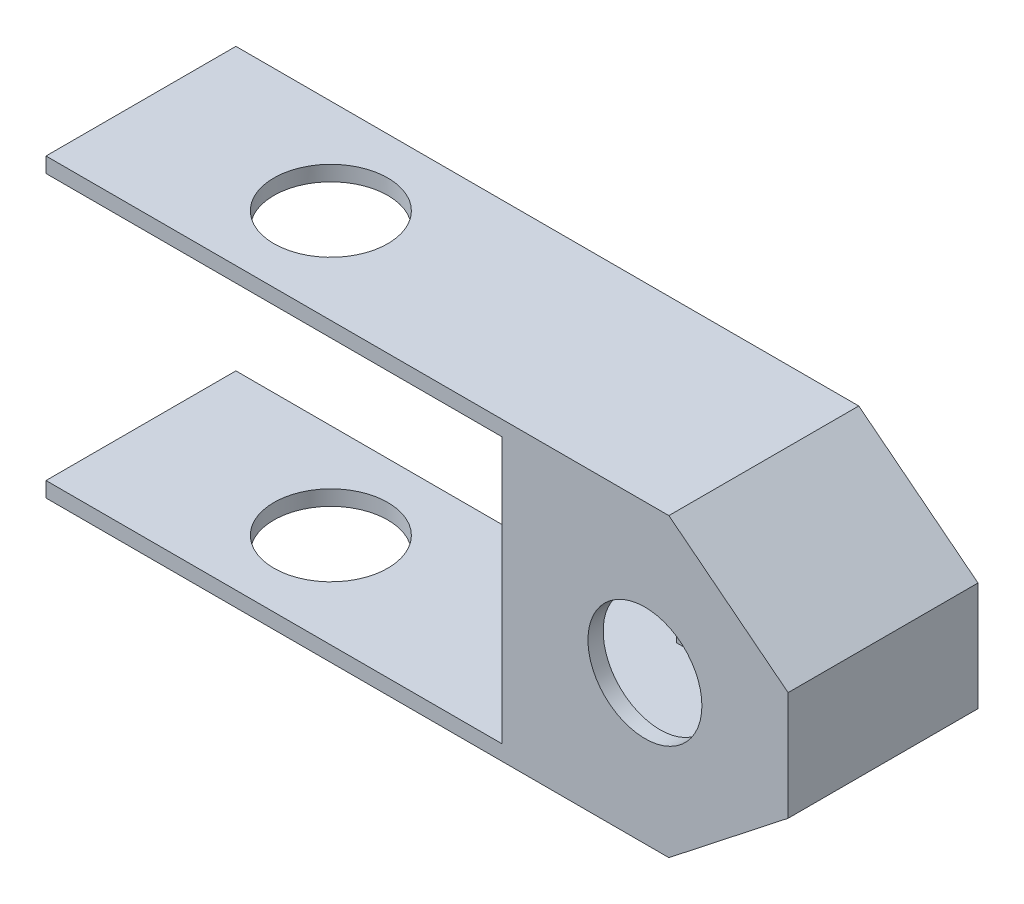
ISO-10303-21;
HEADER;
FILE_DESCRIPTION(('STEP AP214'),'2;1');
FILE_NAME('part.step','',(''),(''),'','','');
FILE_SCHEMA(('AUTOMOTIVE_DESIGN { 1 0 10303 214 1 1 1 1 }'));
ENDSEC;
DATA;
#1=APPLICATION_CONTEXT('core data for automotive mechanical design processes');
#2=APPLICATION_PROTOCOL_DEFINITION('international standard','automotive_design',2000,#1);
#3=PRODUCT_CONTEXT('',#1,'mechanical');
#4=PRODUCT('Part','Part','',(#3));
#5=PRODUCT_RELATED_PRODUCT_CATEGORY('part','',(#4));
#6=PRODUCT_DEFINITION_FORMATION('','',#4);
#7=PRODUCT_DEFINITION_CONTEXT('part definition',#1,'design');
#8=PRODUCT_DEFINITION('design','',#6,#7);
#9=PRODUCT_DEFINITION_SHAPE('','',#8);
#10=(LENGTH_UNIT() NAMED_UNIT(*) SI_UNIT(.MILLI.,.METRE.));
#11=(NAMED_UNIT(*) PLANE_ANGLE_UNIT() SI_UNIT($,.RADIAN.));
#12=(NAMED_UNIT(*) SI_UNIT($,.STERADIAN.) SOLID_ANGLE_UNIT());
#13=UNCERTAINTY_MEASURE_WITH_UNIT(LENGTH_MEASURE(1.E-05),#10,'distance_accuracy_value','');
#14=(GEOMETRIC_REPRESENTATION_CONTEXT(3) GLOBAL_UNCERTAINTY_ASSIGNED_CONTEXT((#13)) GLOBAL_UNIT_ASSIGNED_CONTEXT((#10,
#11,#12)) REPRESENTATION_CONTEXT('',''));
#15=CARTESIAN_POINT('',(0.,0.,0.));
#16=DIRECTION('',(0.,0.,1.));
#17=DIRECTION('',(1.,0.,0.));
#18=AXIS2_PLACEMENT_3D('',#15,#16,#17);
#19=CARTESIAN_POINT('',(0.,0.,0.));
#20=DIRECTION('',(-1.,0.,0.));
#21=DIRECTION('',(0.,0.,1.));
#22=AXIS2_PLACEMENT_3D('',#19,#20,#21);
#23=PLANE('',#22);
#24=DIRECTION('',(0.,0.,1.));
#25=VECTOR('',#24,1.);
#26=CARTESIAN_POINT('',(0.,0.,0.));
#27=LINE('',#26,#25);
#28=CARTESIAN_POINT('',(0.,0.,23.));
#29=VERTEX_POINT('',#28);
#30=CARTESIAN_POINT('',(0.,0.,25.));
#31=VERTEX_POINT('',#30);
#32=EDGE_CURVE('E269',#29,#31,#27,.T.);
#33=ORIENTED_EDGE('',*,*,#32,.F.);
#34=DIRECTION('',(0.,-1.,0.));
#35=VECTOR('',#34,1.);
#36=CARTESIAN_POINT('',(0.,0.,23.));
#37=LINE('',#36,#35);
#38=CARTESIAN_POINT('',(0.,-35.,23.));
#39=VERTEX_POINT('',#38);
#40=EDGE_CURVE('E218',#29,#39,#37,.T.);
#41=ORIENTED_EDGE('',*,*,#40,.T.);
#42=DIRECTION('',(0.,0.,1.));
#43=VECTOR('',#42,1.);
#44=CARTESIAN_POINT('',(0.,-35.,0.));
#45=LINE('',#44,#43);
#46=CARTESIAN_POINT('',(0.,-35.,25.));
#47=VERTEX_POINT('',#46);
#48=EDGE_CURVE('E248',#39,#47,#45,.T.);
#49=ORIENTED_EDGE('',*,*,#48,.T.);
#50=DIRECTION('',(0.,-1.,0.));
#51=VECTOR('',#50,1.);
#52=CARTESIAN_POINT('',(0.,0.,25.));
#53=LINE('',#52,#51);
#54=EDGE_CURVE('E252',#31,#47,#53,.T.);
#55=ORIENTED_EDGE('',*,*,#54,.F.);
#56=EDGE_LOOP('',(#33,#41,#49,#55));
#57=FACE_BOUND('',#56,.T.);
#58=ADVANCED_FACE('F41',(#57),#23,.T.);
#59=CARTESIAN_POINT('',(-60.,0.,25.));
#60=DIRECTION('',(1.,0.,0.));
#61=DIRECTION('',(0.,0.,-1.));
#62=AXIS2_PLACEMENT_3D('',#59,#60,#61);
#63=PLANE('',#62);
#64=DIRECTION('',(0.,0.,1.));
#65=VECTOR('',#64,1.);
#66=CARTESIAN_POINT('',(-60.,-35.,0.));
#67=LINE('',#66,#65);
#68=CARTESIAN_POINT('',(-60.,-35.,0.));
#69=VERTEX_POINT('',#68);
#70=CARTESIAN_POINT('',(-60.,-35.,25.));
#71=VERTEX_POINT('',#70);
#72=EDGE_CURVE('E259',#69,#71,#67,.T.);
#73=ORIENTED_EDGE('',*,*,#72,.F.);
#74=DIRECTION('',(0.,-1.,0.));
#75=VECTOR('',#74,1.);
#76=CARTESIAN_POINT('',(-60.,0.,0.));
#77=LINE('',#76,#75);
#78=CARTESIAN_POINT('',(-60.,-37.,0.));
#79=VERTEX_POINT('',#78);
#80=EDGE_CURVE('E262',#69,#79,#77,.T.);
#81=ORIENTED_EDGE('',*,*,#80,.T.);
#82=DIRECTION('',(0.,0.,-1.));
#83=VECTOR('',#82,1.);
#84=CARTESIAN_POINT('',(-60.,-37.,25.));
#85=LINE('',#84,#83);
#86=CARTESIAN_POINT('',(-60.,-37.,25.));
#87=VERTEX_POINT('',#86);
#88=EDGE_CURVE('E11',#87,#79,#85,.T.);
#89=ORIENTED_EDGE('',*,*,#88,.F.);
#90=DIRECTION('',(0.,-1.,0.));
#91=VECTOR('',#90,1.);
#92=CARTESIAN_POINT('',(-60.,0.,25.));
#93=LINE('',#92,#91);
#94=EDGE_CURVE('E279',#71,#87,#93,.T.);
#95=ORIENTED_EDGE('',*,*,#94,.F.);
#96=EDGE_LOOP('',(#73,#81,#89,#95));
#97=FACE_BOUND('',#96,.T.);
#98=ADVANCED_FACE('F43',(#97),#63,.F.);
#99=DIRECTION('',(0.,0.,1.));
#100=VECTOR('',#99,1.);
#101=CARTESIAN_POINT('',(-60.,0.,0.));
#102=LINE('',#101,#100);
#103=CARTESIAN_POINT('',(-60.,0.,0.));
#104=VERTEX_POINT('',#103);
#105=CARTESIAN_POINT('',(-60.,0.,25.));
#106=VERTEX_POINT('',#105);
#107=EDGE_CURVE('E263',#104,#106,#102,.T.);
#108=ORIENTED_EDGE('',*,*,#107,.T.);
#109=CARTESIAN_POINT('',(-60.,1.99999999999999,25.));
#110=VERTEX_POINT('',#109);
#111=EDGE_CURVE('E274',#110,#106,#93,.T.);
#112=ORIENTED_EDGE('',*,*,#111,.F.);
#113=DIRECTION('',(0.,0.,-1.));
#114=VECTOR('',#113,1.);
#115=CARTESIAN_POINT('',(-60.,1.99999999999999,25.));
#116=LINE('',#115,#114);
#117=CARTESIAN_POINT('',(-60.,1.99999999999999,0.));
#118=VERTEX_POINT('',#117);
#119=EDGE_CURVE('E297',#110,#118,#116,.T.);
#120=ORIENTED_EDGE('',*,*,#119,.T.);
#121=EDGE_CURVE('E298',#118,#104,#77,.T.);
#122=ORIENTED_EDGE('',*,*,#121,.T.);
#123=EDGE_LOOP('',(#108,#112,#120,#122));
#124=FACE_BOUND('',#123,.T.);
#125=ADVANCED_FACE('F352',(#124),#63,.F.);
#126=CARTESIAN_POINT('',(0.,0.,25.));
#127=DIRECTION('',(0.,0.,1.));
#128=DIRECTION('',(1.,0.,0.));
#129=AXIS2_PLACEMENT_3D('',#126,#127,#128);
#130=PLANE('',#129);
#131=CARTESIAN_POINT('',(18.8484526302729,-17.5,25.));
#132=DIRECTION('',(0.,0.,1.));
#133=DIRECTION('',(1.,0.,0.));
#134=AXIS2_PLACEMENT_3D('',#131,#132,#133);
#135=CIRCLE('',#134,7.5);
#136=CARTESIAN_POINT('',(26.3484526302729,-17.5,25.));
#137=VERTEX_POINT('',#136);
#138=EDGE_CURVE('E448',#137,#137,#135,.T.);
#139=ORIENTED_EDGE('',*,*,#138,.F.);
#140=EDGE_LOOP('',(#139));
#141=FACE_BOUND('',#140,.T.);
#142=ORIENTED_EDGE('',*,*,#54,.T.);
#143=DIRECTION('',(-1.,0.,0.));
#144=VECTOR('',#143,1.);
#145=CARTESIAN_POINT('',(0.,-35.,25.));
#146=LINE('',#145,#144);
#147=EDGE_CURVE('E237',#47,#71,#146,.T.);
#148=ORIENTED_EDGE('',*,*,#147,.T.);
#149=ORIENTED_EDGE('',*,*,#94,.T.);
#150=DIRECTION('',(-1.,0.,0.));
#151=VECTOR('',#150,1.);
#152=CARTESIAN_POINT('',(0.,-37.,25.));
#153=LINE('',#152,#151);
#154=CARTESIAN_POINT('',(22.,-37.,25.));
#155=VERTEX_POINT('',#154);
#156=EDGE_CURVE('E278',#155,#87,#153,.T.);
#157=ORIENTED_EDGE('',*,*,#156,.F.);
#158=DIRECTION('',(0.78628435317527,0.617864803943182,0.));
#159=VECTOR('',#158,1.);
#160=CARTESIAN_POINT('',(26.3738969765129,-33.5629775195864,25.));
#161=LINE('',#160,#159);
#162=CARTESIAN_POINT('',(37.6969052605458,-24.6653207555818,25.));
#163=VERTEX_POINT('',#162);
#164=EDGE_CURVE('E283',#155,#163,#161,.T.);
#165=ORIENTED_EDGE('',*,*,#164,.T.);
#166=DIRECTION('',(0.,1.,0.));
#167=VECTOR('',#166,1.);
#168=CARTESIAN_POINT('',(37.6969052605458,0.,25.));
#169=LINE('',#168,#167);
#170=CARTESIAN_POINT('',(37.6969052605458,-10.3346792444182,25.));
#171=VERTEX_POINT('',#170);
#172=EDGE_CURVE('E286',#163,#171,#169,.T.);
#173=ORIENTED_EDGE('',*,*,#172,.T.);
#174=DIRECTION('',(0.78628435317527,-0.617864803943182,0.));
#175=VECTOR('',#174,1.);
#176=CARTESIAN_POINT('',(9.37028700637488,11.9244695778976,25.));
#177=LINE('',#176,#175);
#178=CARTESIAN_POINT('',(22.,2.,25.));
#179=VERTEX_POINT('',#178);
#180=EDGE_CURVE('E289',#179,#171,#177,.T.);
#181=ORIENTED_EDGE('',*,*,#180,.F.);
#182=DIRECTION('',(1.,0.,0.));
#183=VECTOR('',#182,1.);
#184=CARTESIAN_POINT('',(0.,2.,25.));
#185=LINE('',#184,#183);
#186=EDGE_CURVE('E293',#110,#179,#185,.T.);
#187=ORIENTED_EDGE('',*,*,#186,.F.);
#188=ORIENTED_EDGE('',*,*,#111,.T.);
#189=DIRECTION('',(1.,0.,0.));
#190=VECTOR('',#189,1.);
#191=CARTESIAN_POINT('',(0.,0.,25.));
#192=LINE('',#191,#190);
#193=EDGE_CURVE('E242',#106,#31,#192,.T.);
#194=ORIENTED_EDGE('',*,*,#193,.T.);
#195=EDGE_LOOP('',(#142,#148,#149,#157,#165,#173,#181,#187,#188,#194));
#196=FACE_BOUND('',#195,.T.);
#197=ADVANCED_FACE('F355',(#141,#196),#130,.T.);
#198=CARTESIAN_POINT('',(0.,0.,0.));
#199=DIRECTION('',(0.,0.,1.));
#200=DIRECTION('',(1.,0.,0.));
#201=AXIS2_PLACEMENT_3D('',#198,#199,#200);
#202=PLANE('',#201);
#203=CARTESIAN_POINT('',(18.8484526302729,-17.5,0.));
#204=DIRECTION('',(0.,0.,1.));
#205=DIRECTION('',(1.,0.,0.));
#206=AXIS2_PLACEMENT_3D('',#203,#204,#205);
#207=CIRCLE('',#206,7.5);
#208=CARTESIAN_POINT('',(26.3484526302729,-17.5,0.));
#209=VERTEX_POINT('',#208);
#210=EDGE_CURVE('E222',#209,#209,#207,.T.);
#211=ORIENTED_EDGE('',*,*,#210,.T.);
#212=EDGE_LOOP('',(#211));
#213=FACE_BOUND('',#212,.T.);
#214=DIRECTION('',(-1.,0.,0.));
#215=VECTOR('',#214,1.);
#216=CARTESIAN_POINT('',(0.,-35.,0.));
#217=LINE('',#216,#215);
#218=CARTESIAN_POINT('',(0.,-35.,0.));
#219=VERTEX_POINT('',#218);
#220=EDGE_CURVE('E238',#219,#69,#217,.T.);
#221=ORIENTED_EDGE('',*,*,#220,.F.);
#222=DIRECTION('',(0.,-1.,0.));
#223=VECTOR('',#222,1.);
#224=CARTESIAN_POINT('',(0.,0.,0.));
#225=LINE('',#224,#223);
#226=CARTESIAN_POINT('',(0.,0.,0.));
#227=VERTEX_POINT('',#226);
#228=EDGE_CURVE('E241',#227,#219,#225,.T.);
#229=ORIENTED_EDGE('',*,*,#228,.F.);
#230=DIRECTION('',(1.,0.,0.));
#231=VECTOR('',#230,1.);
#232=CARTESIAN_POINT('',(0.,0.,0.));
#233=LINE('',#232,#231);
#234=EDGE_CURVE('E245',#104,#227,#233,.T.);
#235=ORIENTED_EDGE('',*,*,#234,.F.);
#236=ORIENTED_EDGE('',*,*,#121,.F.);
#237=DIRECTION('',(1.,0.,0.));
#238=VECTOR('',#237,1.);
#239=CARTESIAN_POINT('',(0.,2.,0.));
#240=LINE('',#239,#238);
#241=CARTESIAN_POINT('',(22.,2.,0.));
#242=VERTEX_POINT('',#241);
#243=EDGE_CURVE('E317',#118,#242,#240,.T.);
#244=ORIENTED_EDGE('',*,*,#243,.T.);
#245=DIRECTION('',(0.78628435317527,-0.617864803943182,0.));
#246=VECTOR('',#245,1.);
#247=CARTESIAN_POINT('',(9.37028700637488,11.9244695778976,0.));
#248=LINE('',#247,#246);
#249=CARTESIAN_POINT('',(37.6969052605458,-10.3346792444182,0.));
#250=VERTEX_POINT('',#249);
#251=EDGE_CURVE('E313',#242,#250,#248,.T.);
#252=ORIENTED_EDGE('',*,*,#251,.T.);
#253=DIRECTION('',(0.,1.,0.));
#254=VECTOR('',#253,1.);
#255=CARTESIAN_POINT('',(37.6969052605458,0.,0.));
#256=LINE('',#255,#254);
#257=CARTESIAN_POINT('',(37.6969052605458,-24.6653207555818,0.));
#258=VERTEX_POINT('',#257);
#259=EDGE_CURVE('E309',#258,#250,#256,.T.);
#260=ORIENTED_EDGE('',*,*,#259,.F.);
#261=DIRECTION('',(0.78628435317527,0.617864803943182,0.));
#262=VECTOR('',#261,1.);
#263=CARTESIAN_POINT('',(26.3738969765129,-33.5629775195864,0.));
#264=LINE('',#263,#262);
#265=CARTESIAN_POINT('',(22.,-37.,0.));
#266=VERTEX_POINT('',#265);
#267=EDGE_CURVE('E306',#266,#258,#264,.T.);
#268=ORIENTED_EDGE('',*,*,#267,.F.);
#269=DIRECTION('',(-1.,0.,0.));
#270=VECTOR('',#269,1.);
#271=CARTESIAN_POINT('',(0.,-37.,0.));
#272=LINE('',#271,#270);
#273=EDGE_CURVE('E302',#266,#79,#272,.T.);
#274=ORIENTED_EDGE('',*,*,#273,.T.);
#275=ORIENTED_EDGE('',*,*,#80,.F.);
#276=EDGE_LOOP('',(#221,#229,#235,#236,#244,#252,#260,#268,#274,#275));
#277=FACE_BOUND('',#276,.T.);
#278=ADVANCED_FACE('F363',(#213,#277),#202,.F.);
#279=CARTESIAN_POINT('',(0.,-37.,25.));
#280=DIRECTION('',(0.,-1.,0.));
#281=DIRECTION('',(1.,0.,0.));
#282=AXIS2_PLACEMENT_3D('',#279,#280,#281);
#283=PLANE('',#282);
#284=CARTESIAN_POINT('',(-35.,-37.,12.5));
#285=DIRECTION('',(0.,-1.,0.));
#286=DIRECTION('',(1.,0.,0.));
#287=AXIS2_PLACEMENT_3D('',#284,#285,#286);
#288=CIRCLE('',#287,7.5);
#289=CARTESIAN_POINT('',(-27.5,-37.,12.5));
#290=VERTEX_POINT('',#289);
#291=EDGE_CURVE('E233',#290,#290,#288,.T.);
#292=ORIENTED_EDGE('',*,*,#291,.F.);
#293=EDGE_LOOP('',(#292));
#294=FACE_BOUND('',#293,.T.);
#295=ORIENTED_EDGE('',*,*,#273,.F.);
#296=DIRECTION('',(0.,0.,-1.));
#297=VECTOR('',#296,1.);
#298=CARTESIAN_POINT('',(22.,-37.,25.));
#299=LINE('',#298,#297);
#300=EDGE_CURVE('E51',#155,#266,#299,.T.);
#301=ORIENTED_EDGE('',*,*,#300,.F.);
#302=ORIENTED_EDGE('',*,*,#156,.T.);
#303=ORIENTED_EDGE('',*,*,#88,.T.);
#304=EDGE_LOOP('',(#295,#301,#302,#303));
#305=FACE_BOUND('',#304,.T.);
#306=ADVANCED_FACE('F400',(#294,#305),#283,.T.);
#307=CARTESIAN_POINT('',(26.3738969765129,-33.5629775195864,25.));
#308=DIRECTION('',(-0.617864803943182,0.78628435317527,0.));
#309=DIRECTION('',(-0.78628435317527,-0.617864803943182,0.));
#310=AXIS2_PLACEMENT_3D('',#307,#308,#309);
#311=PLANE('',#310);
#312=ORIENTED_EDGE('',*,*,#267,.T.);
#313=DIRECTION('',(0.,0.,-1.));
#314=VECTOR('',#313,1.);
#315=CARTESIAN_POINT('',(37.6969052605458,-24.6653207555818,25.));
#316=LINE('',#315,#314);
#317=EDGE_CURVE('E329',#163,#258,#316,.T.);
#318=ORIENTED_EDGE('',*,*,#317,.F.);
#319=ORIENTED_EDGE('',*,*,#164,.F.);
#320=ORIENTED_EDGE('',*,*,#300,.T.);
#321=EDGE_LOOP('',(#312,#318,#319,#320));
#322=FACE_BOUND('',#321,.T.);
#323=ADVANCED_FACE('F405',(#322),#311,.F.);
#324=CARTESIAN_POINT('',(37.6969052605458,0.,25.));
#325=DIRECTION('',(-1.,0.,0.));
#326=DIRECTION('',(0.,0.,1.));
#327=AXIS2_PLACEMENT_3D('',#324,#325,#326);
#328=PLANE('',#327);
#329=ORIENTED_EDGE('',*,*,#259,.T.);
#330=DIRECTION('',(0.,0.,-1.));
#331=VECTOR('',#330,1.);
#332=CARTESIAN_POINT('',(37.6969052605458,-10.3346792444182,25.));
#333=LINE('',#332,#331);
#334=EDGE_CURVE('E326',#171,#250,#333,.T.);
#335=ORIENTED_EDGE('',*,*,#334,.F.);
#336=ORIENTED_EDGE('',*,*,#172,.F.);
#337=ORIENTED_EDGE('',*,*,#317,.T.);
#338=EDGE_LOOP('',(#329,#335,#336,#337));
#339=FACE_BOUND('',#338,.T.);
#340=ADVANCED_FACE('F409',(#339),#328,.F.);
#341=CARTESIAN_POINT('',(9.37028700637488,11.9244695778976,25.));
#342=DIRECTION('',(0.617864803943182,0.78628435317527,0.));
#343=DIRECTION('',(-0.78628435317527,0.617864803943182,0.));
#344=AXIS2_PLACEMENT_3D('',#341,#342,#343);
#345=PLANE('',#344);
#346=ORIENTED_EDGE('',*,*,#251,.F.);
#347=DIRECTION('',(0.,0.,-1.));
#348=VECTOR('',#347,1.);
#349=CARTESIAN_POINT('',(22.,2.,25.));
#350=LINE('',#349,#348);
#351=EDGE_CURVE('E323',#179,#242,#350,.T.);
#352=ORIENTED_EDGE('',*,*,#351,.F.);
#353=ORIENTED_EDGE('',*,*,#180,.T.);
#354=ORIENTED_EDGE('',*,*,#334,.T.);
#355=EDGE_LOOP('',(#346,#352,#353,#354));
#356=FACE_BOUND('',#355,.T.);
#357=ADVANCED_FACE('F412',(#356),#345,.T.);
#358=CARTESIAN_POINT('',(0.,2.,25.));
#359=DIRECTION('',(0.,1.,0.));
#360=DIRECTION('',(0.,0.,1.));
#361=AXIS2_PLACEMENT_3D('',#358,#359,#360);
#362=PLANE('',#361);
#363=CARTESIAN_POINT('',(-35.,2.,12.5));
#364=DIRECTION('',(0.,1.,0.));
#365=DIRECTION('',(0.,0.,1.));
#366=AXIS2_PLACEMENT_3D('',#363,#364,#365);
#367=CIRCLE('',#366,7.5);
#368=CARTESIAN_POINT('',(-35.,2.,20.));
#369=VERTEX_POINT('',#368);
#370=EDGE_CURVE('E211',#369,#369,#367,.T.);
#371=ORIENTED_EDGE('',*,*,#370,.F.);
#372=EDGE_LOOP('',(#371));
#373=FACE_BOUND('',#372,.T.);
#374=ORIENTED_EDGE('',*,*,#243,.F.);
#375=ORIENTED_EDGE('',*,*,#119,.F.);
#376=ORIENTED_EDGE('',*,*,#186,.T.);
#377=ORIENTED_EDGE('',*,*,#351,.T.);
#378=EDGE_LOOP('',(#374,#375,#376,#377));
#379=FACE_BOUND('',#378,.T.);
#380=ADVANCED_FACE('F359',(#373,#379),#362,.T.);
#381=CARTESIAN_POINT('',(0.,-35.,0.));
#382=DIRECTION('',(0.,1.,0.));
#383=DIRECTION('',(0.,0.,1.));
#384=AXIS2_PLACEMENT_3D('',#381,#382,#383);
#385=PLANE('',#384);
#386=CARTESIAN_POINT('',(-35.,-35.,12.5));
#387=DIRECTION('',(0.,1.,0.));
#388=DIRECTION('',(0.,0.,1.));
#389=AXIS2_PLACEMENT_3D('',#386,#387,#388);
#390=CIRCLE('',#389,7.5);
#391=CARTESIAN_POINT('',(-35.,-35.,20.));
#392=VERTEX_POINT('',#391);
#393=EDGE_CURVE('E229',#392,#392,#390,.T.);
#394=ORIENTED_EDGE('',*,*,#393,.F.);
#395=EDGE_LOOP('',(#394));
#396=FACE_BOUND('',#395,.T.);
#397=ORIENTED_EDGE('',*,*,#147,.F.);
#398=ORIENTED_EDGE('',*,*,#48,.F.);
#399=DIRECTION('',(-1.,0.,0.));
#400=VECTOR('',#399,1.);
#401=CARTESIAN_POINT('',(0.,-35.,23.));
#402=LINE('',#401,#400);
#403=CARTESIAN_POINT('',(21.3082122643633,-35.,23.));
#404=VERTEX_POINT('',#403);
#405=EDGE_CURVE('E170',#404,#39,#402,.T.);
#406=ORIENTED_EDGE('',*,*,#405,.F.);
#407=DIRECTION('',(0.,0.,-1.));
#408=VECTOR('',#407,1.);
#409=CARTESIAN_POINT('',(21.3082122643633,-35.,25.));
#410=LINE('',#409,#408);
#411=CARTESIAN_POINT('',(21.3082122643633,-35.,2.));
#412=VERTEX_POINT('',#411);
#413=EDGE_CURVE('E165',#404,#412,#410,.T.);
#414=ORIENTED_EDGE('',*,*,#413,.T.);
#415=DIRECTION('',(-1.,0.,0.));
#416=VECTOR('',#415,1.);
#417=CARTESIAN_POINT('',(0.,-35.,2.));
#418=LINE('',#417,#416);
#419=CARTESIAN_POINT('',(0.,-35.,2.));
#420=VERTEX_POINT('',#419);
#421=EDGE_CURVE('E205',#412,#420,#418,.T.);
#422=ORIENTED_EDGE('',*,*,#421,.T.);
#423=EDGE_CURVE('E270',#219,#420,#45,.T.);
#424=ORIENTED_EDGE('',*,*,#423,.F.);
#425=ORIENTED_EDGE('',*,*,#220,.T.);
#426=ORIENTED_EDGE('',*,*,#72,.T.);
#427=EDGE_LOOP('',(#397,#398,#406,#414,#422,#424,#425,#426));
#428=FACE_BOUND('',#427,.T.);
#429=ADVANCED_FACE('F344',(#396,#428),#385,.T.);
#430=CARTESIAN_POINT('',(0.,0.,0.));
#431=DIRECTION('',(0.,-1.,0.));
#432=DIRECTION('',(0.,0.,-1.));
#433=AXIS2_PLACEMENT_3D('',#430,#431,#432);
#434=PLANE('',#433);
#435=CARTESIAN_POINT('',(-35.,0.,12.5));
#436=DIRECTION('',(0.,-1.,0.));
#437=DIRECTION('',(0.,0.,-1.));
#438=AXIS2_PLACEMENT_3D('',#435,#436,#437);
#439=CIRCLE('',#438,7.5);
#440=CARTESIAN_POINT('',(-35.,0.,5.));
#441=VERTEX_POINT('',#440);
#442=EDGE_CURVE('E228',#441,#441,#439,.T.);
#443=ORIENTED_EDGE('',*,*,#442,.F.);
#444=EDGE_LOOP('',(#443));
#445=FACE_BOUND('',#444,.T.);
#446=ORIENTED_EDGE('',*,*,#193,.F.);
#447=ORIENTED_EDGE('',*,*,#107,.F.);
#448=ORIENTED_EDGE('',*,*,#234,.T.);
#449=CARTESIAN_POINT('',(0.,0.,2.));
#450=VERTEX_POINT('',#449);
#451=EDGE_CURVE('E67',#227,#450,#27,.T.);
#452=ORIENTED_EDGE('',*,*,#451,.T.);
#453=DIRECTION('',(1.,0.,0.));
#454=VECTOR('',#453,1.);
#455=CARTESIAN_POINT('',(0.,0.,2.));
#456=LINE('',#455,#454);
#457=CARTESIAN_POINT('',(21.3082122643633,0.,2.));
#458=VERTEX_POINT('',#457);
#459=EDGE_CURVE('E193',#450,#458,#456,.T.);
#460=ORIENTED_EDGE('',*,*,#459,.T.);
#461=DIRECTION('',(0.,0.,-1.));
#462=VECTOR('',#461,1.);
#463=CARTESIAN_POINT('',(21.3082122643633,0.,25.));
#464=LINE('',#463,#462);
#465=CARTESIAN_POINT('',(21.3082122643633,0.,23.));
#466=VERTEX_POINT('',#465);
#467=EDGE_CURVE('E192',#466,#458,#464,.T.);
#468=ORIENTED_EDGE('',*,*,#467,.F.);
#469=DIRECTION('',(1.,0.,0.));
#470=VECTOR('',#469,1.);
#471=CARTESIAN_POINT('',(0.,0.,23.));
#472=LINE('',#471,#470);
#473=EDGE_CURVE('E59',#29,#466,#472,.T.);
#474=ORIENTED_EDGE('',*,*,#473,.F.);
#475=ORIENTED_EDGE('',*,*,#32,.T.);
#476=EDGE_LOOP('',(#446,#447,#448,#452,#460,#468,#474,#475));
#477=FACE_BOUND('',#476,.T.);
#478=ADVANCED_FACE('F341',(#445,#477),#434,.T.);
#479=DIRECTION('',(0.,-1.,0.));
#480=VECTOR('',#479,1.);
#481=CARTESIAN_POINT('',(0.,0.,2.));
#482=LINE('',#481,#480);
#483=EDGE_CURVE('E209',#450,#420,#482,.T.);
#484=ORIENTED_EDGE('',*,*,#483,.F.);
#485=ORIENTED_EDGE('',*,*,#451,.F.);
#486=ORIENTED_EDGE('',*,*,#228,.T.);
#487=ORIENTED_EDGE('',*,*,#423,.T.);
#488=EDGE_LOOP('',(#484,#485,#486,#487));
#489=FACE_BOUND('',#488,.T.);
#490=ADVANCED_FACE('F343',(#489),#23,.T.);
#491=CARTESIAN_POINT('',(-35.,-65.,12.5));
#492=DIRECTION('',(0.,1.,0.));
#493=DIRECTION('',(0.,0.,1.));
#494=AXIS2_PLACEMENT_3D('',#491,#492,#493);
#495=CYLINDRICAL_SURFACE('',#494,7.5);
#496=ORIENTED_EDGE('',*,*,#442,.T.);
#497=EDGE_LOOP('',(#496));
#498=FACE_BOUND('',#497,.T.);
#499=ORIENTED_EDGE('',*,*,#370,.T.);
#500=EDGE_LOOP('',(#499));
#501=FACE_BOUND('',#500,.T.);
#502=ADVANCED_FACE('F338',(#498,#501),#495,.F.);
#503=ORIENTED_EDGE('',*,*,#291,.T.);
#504=EDGE_LOOP('',(#503));
#505=FACE_BOUND('',#504,.T.);
#506=ORIENTED_EDGE('',*,*,#393,.T.);
#507=EDGE_LOOP('',(#506));
#508=FACE_BOUND('',#507,.T.);
#509=ADVANCED_FACE('F379',(#505,#508),#495,.F.);
#510=CARTESIAN_POINT('',(0.,0.,23.));
#511=DIRECTION('',(0.,0.,1.));
#512=DIRECTION('',(1.,0.,0.));
#513=AXIS2_PLACEMENT_3D('',#510,#511,#512);
#514=PLANE('',#513);
#515=CARTESIAN_POINT('',(18.8484526302729,-17.5,23.));
#516=DIRECTION('',(0.,0.,1.));
#517=DIRECTION('',(1.,0.,0.));
#518=AXIS2_PLACEMENT_3D('',#515,#516,#517);
#519=CIRCLE('',#518,7.5);
#520=CARTESIAN_POINT('',(26.3484526302729,-17.5,23.));
#521=VERTEX_POINT('',#520);
#522=EDGE_CURVE('E454',#521,#521,#519,.T.);
#523=ORIENTED_EDGE('',*,*,#522,.T.);
#524=EDGE_LOOP('',(#523));
#525=FACE_BOUND('',#524,.T.);
#526=ORIENTED_EDGE('',*,*,#473,.T.);
#527=DIRECTION('',(0.78628435317527,-0.617864803943182,0.));
#528=VECTOR('',#527,1.);
#529=CARTESIAN_POINT('',(8.13455739848852,10.351900871547,23.));
#530=LINE('',#529,#528);
#531=CARTESIAN_POINT('',(35.6969052605458,-11.3066817890794,23.));
#532=VERTEX_POINT('',#531);
#533=EDGE_CURVE('E183',#466,#532,#530,.T.);
#534=ORIENTED_EDGE('',*,*,#533,.T.);
#535=DIRECTION('',(0.,1.,0.));
#536=VECTOR('',#535,1.);
#537=CARTESIAN_POINT('',(35.6969052605458,0.,23.));
#538=LINE('',#537,#536);
#539=CARTESIAN_POINT('',(35.6969052605458,-23.6933182109206,23.));
#540=VERTEX_POINT('',#539);
#541=EDGE_CURVE('E169',#540,#532,#538,.T.);
#542=ORIENTED_EDGE('',*,*,#541,.F.);
#543=DIRECTION('',(0.78628435317527,0.617864803943182,0.));
#544=VECTOR('',#543,1.);
#545=CARTESIAN_POINT('',(25.1381673686266,-31.9904088132359,23.));
#546=LINE('',#545,#544);
#547=EDGE_CURVE('E159',#404,#540,#546,.T.);
#548=ORIENTED_EDGE('',*,*,#547,.F.);
#549=ORIENTED_EDGE('',*,*,#405,.T.);
#550=ORIENTED_EDGE('',*,*,#40,.F.);
#551=EDGE_LOOP('',(#526,#534,#542,#548,#549,#550));
#552=FACE_BOUND('',#551,.T.);
#553=ADVANCED_FACE('F181',(#525,#552),#514,.F.);
#554=CARTESIAN_POINT('',(0.,0.,2.));
#555=DIRECTION('',(0.,0.,1.));
#556=DIRECTION('',(1.,0.,0.));
#557=AXIS2_PLACEMENT_3D('',#554,#555,#556);
#558=PLANE('',#557);
#559=CARTESIAN_POINT('',(18.8484526302729,-17.5,2.));
#560=DIRECTION('',(0.,0.,1.));
#561=DIRECTION('',(1.,0.,0.));
#562=AXIS2_PLACEMENT_3D('',#559,#560,#561);
#563=CIRCLE('',#562,7.5);
#564=CARTESIAN_POINT('',(26.3484526302729,-17.5,2.));
#565=VERTEX_POINT('',#564);
#566=EDGE_CURVE('E45',#565,#565,#563,.T.);
#567=ORIENTED_EDGE('',*,*,#566,.F.);
#568=EDGE_LOOP('',(#567));
#569=FACE_BOUND('',#568,.T.);
#570=ORIENTED_EDGE('',*,*,#421,.F.);
#571=DIRECTION('',(0.78628435317527,0.617864803943182,0.));
#572=VECTOR('',#571,1.);
#573=CARTESIAN_POINT('',(25.1381673686266,-31.9904088132359,2.));
#574=LINE('',#573,#572);
#575=CARTESIAN_POINT('',(35.6969052605458,-23.6933182109206,2.));
#576=VERTEX_POINT('',#575);
#577=EDGE_CURVE('E202',#412,#576,#574,.T.);
#578=ORIENTED_EDGE('',*,*,#577,.T.);
#579=DIRECTION('',(0.,1.,0.));
#580=VECTOR('',#579,1.);
#581=CARTESIAN_POINT('',(35.6969052605458,0.,2.));
#582=LINE('',#581,#580);
#583=CARTESIAN_POINT('',(35.6969052605458,-11.3066817890794,2.));
#584=VERTEX_POINT('',#583);
#585=EDGE_CURVE('E176',#576,#584,#582,.T.);
#586=ORIENTED_EDGE('',*,*,#585,.T.);
#587=DIRECTION('',(0.78628435317527,-0.617864803943182,0.));
#588=VECTOR('',#587,1.);
#589=CARTESIAN_POINT('',(8.13455739848852,10.351900871547,2.));
#590=LINE('',#589,#588);
#591=EDGE_CURVE('E196',#458,#584,#590,.T.);
#592=ORIENTED_EDGE('',*,*,#591,.F.);
#593=ORIENTED_EDGE('',*,*,#459,.F.);
#594=ORIENTED_EDGE('',*,*,#483,.T.);
#595=EDGE_LOOP('',(#570,#578,#586,#592,#593,#594));
#596=FACE_BOUND('',#595,.T.);
#597=ADVANCED_FACE('F370',(#569,#596),#558,.T.);
#598=CARTESIAN_POINT('',(25.1381673686266,-31.9904088132359,25.));
#599=DIRECTION('',(-0.617864803943182,0.78628435317527,0.));
#600=DIRECTION('',(-0.78628435317527,-0.617864803943182,0.));
#601=AXIS2_PLACEMENT_3D('',#598,#599,#600);
#602=PLANE('',#601);
#603=ORIENTED_EDGE('',*,*,#577,.F.);
#604=ORIENTED_EDGE('',*,*,#413,.F.);
#605=ORIENTED_EDGE('',*,*,#547,.T.);
#606=DIRECTION('',(0.,0.,-1.));
#607=VECTOR('',#606,1.);
#608=CARTESIAN_POINT('',(35.6969052605458,-23.6933182109206,25.));
#609=LINE('',#608,#607);
#610=EDGE_CURVE('E163',#540,#576,#609,.T.);
#611=ORIENTED_EDGE('',*,*,#610,.T.);
#612=EDGE_LOOP('',(#603,#604,#605,#611));
#613=FACE_BOUND('',#612,.T.);
#614=ADVANCED_FACE('F162',(#613),#602,.T.);
#615=CARTESIAN_POINT('',(35.6969052605458,0.,25.));
#616=DIRECTION('',(-1.,0.,0.));
#617=DIRECTION('',(0.,0.,1.));
#618=AXIS2_PLACEMENT_3D('',#615,#616,#617);
#619=PLANE('',#618);
#620=ORIENTED_EDGE('',*,*,#585,.F.);
#621=ORIENTED_EDGE('',*,*,#610,.F.);
#622=ORIENTED_EDGE('',*,*,#541,.T.);
#623=DIRECTION('',(0.,0.,-1.));
#624=VECTOR('',#623,1.);
#625=CARTESIAN_POINT('',(35.6969052605458,-11.3066817890794,25.));
#626=LINE('',#625,#624);
#627=EDGE_CURVE('E178',#532,#584,#626,.T.);
#628=ORIENTED_EDGE('',*,*,#627,.T.);
#629=EDGE_LOOP('',(#620,#621,#622,#628));
#630=FACE_BOUND('',#629,.T.);
#631=ADVANCED_FACE('F173',(#630),#619,.T.);
#632=CARTESIAN_POINT('',(8.13455739848852,10.351900871547,25.));
#633=DIRECTION('',(0.617864803943182,0.78628435317527,0.));
#634=DIRECTION('',(-0.78628435317527,0.617864803943182,0.));
#635=AXIS2_PLACEMENT_3D('',#632,#633,#634);
#636=PLANE('',#635);
#637=ORIENTED_EDGE('',*,*,#591,.T.);
#638=ORIENTED_EDGE('',*,*,#627,.F.);
#639=ORIENTED_EDGE('',*,*,#533,.F.);
#640=ORIENTED_EDGE('',*,*,#467,.T.);
#641=EDGE_LOOP('',(#637,#638,#639,#640));
#642=FACE_BOUND('',#641,.T.);
#643=ADVANCED_FACE('F368',(#642),#636,.F.);
#644=CARTESIAN_POINT('',(18.8484526302729,-17.5,-42.));
#645=DIRECTION('',(0.,0.,1.));
#646=DIRECTION('',(1.,0.,0.));
#647=AXIS2_PLACEMENT_3D('',#644,#645,#646);
#648=CYLINDRICAL_SURFACE('',#647,7.5);
#649=ORIENTED_EDGE('',*,*,#566,.T.);
#650=EDGE_LOOP('',(#649));
#651=FACE_BOUND('',#650,.T.);
#652=ORIENTED_EDGE('',*,*,#210,.F.);
#653=EDGE_LOOP('',(#652));
#654=FACE_BOUND('',#653,.T.);
#655=ADVANCED_FACE('F464',(#651,#654),#648,.F.);
#656=ORIENTED_EDGE('',*,*,#138,.T.);
#657=EDGE_LOOP('',(#656));
#658=FACE_BOUND('',#657,.T.);
#659=ORIENTED_EDGE('',*,*,#522,.F.);
#660=EDGE_LOOP('',(#659));
#661=FACE_BOUND('',#660,.T.);
#662=ADVANCED_FACE('F466',(#658,#661),#648,.F.);
#663=CLOSED_SHELL('',(#58,#98,#125,#197,#278,#306,#323,#340,#357,#380,#429,#478,#490,#502,#509,
#553,#597,#614,#631,#643,#655,#662));
#664=MANIFOLD_SOLID_BREP('B2',#663);
#665=ADVANCED_BREP_SHAPE_REPRESENTATION('',(#18,#664),#14);
#666=SHAPE_DEFINITION_REPRESENTATION(#9,#665);
ENDSEC;
END-ISO-10303-21;
